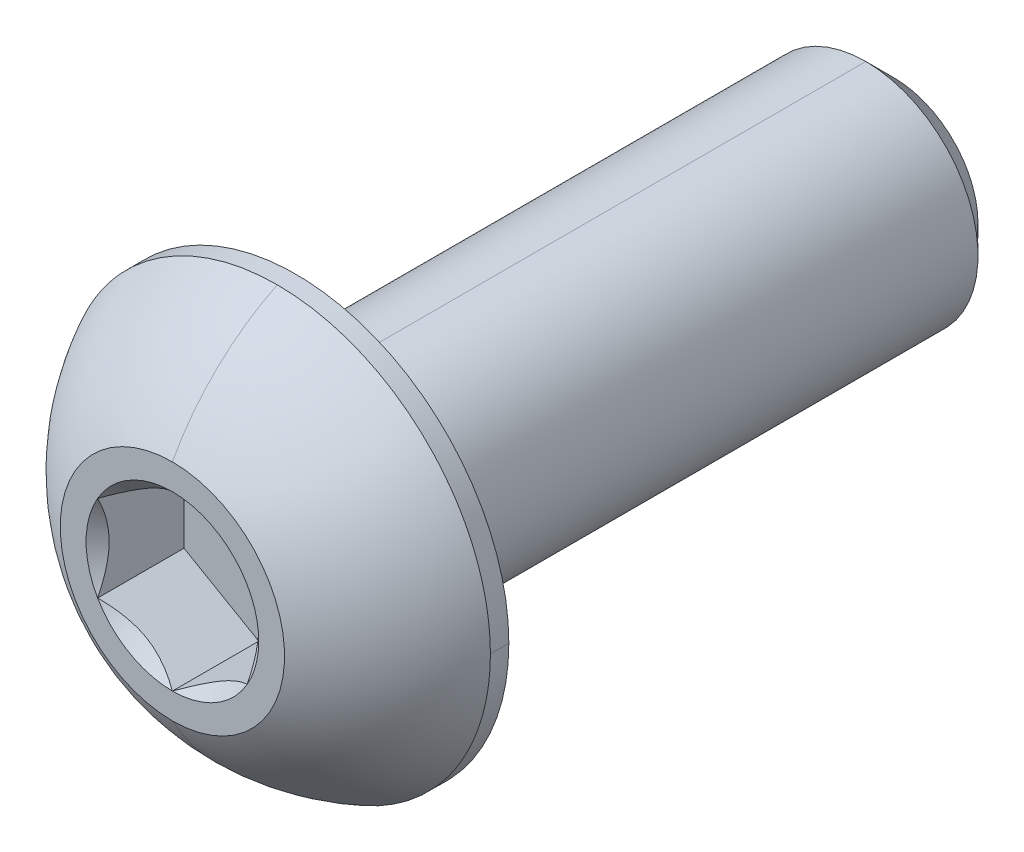
ISO-10303-21;
HEADER;
FILE_DESCRIPTION(('STEP AP214'),'2;1');
FILE_NAME('part.step','',(''),(''),'','','');
FILE_SCHEMA(('AUTOMOTIVE_DESIGN { 1 0 10303 214 1 1 1 1 }'));
ENDSEC;
DATA;
#1=APPLICATION_CONTEXT('core data for automotive mechanical design processes');
#2=APPLICATION_PROTOCOL_DEFINITION('international standard','automotive_design',2000,#1);
#3=PRODUCT_CONTEXT('',#1,'mechanical');
#4=PRODUCT('Part','Part','',(#3));
#5=PRODUCT_RELATED_PRODUCT_CATEGORY('part','',(#4));
#6=PRODUCT_DEFINITION_FORMATION('','',#4);
#7=PRODUCT_DEFINITION_CONTEXT('part definition',#1,'design');
#8=PRODUCT_DEFINITION('design','',#6,#7);
#9=PRODUCT_DEFINITION_SHAPE('','',#8);
#10=(LENGTH_UNIT() NAMED_UNIT(*) SI_UNIT(.MILLI.,.METRE.));
#11=(NAMED_UNIT(*) PLANE_ANGLE_UNIT() SI_UNIT($,.RADIAN.));
#12=(NAMED_UNIT(*) SI_UNIT($,.STERADIAN.) SOLID_ANGLE_UNIT());
#13=UNCERTAINTY_MEASURE_WITH_UNIT(LENGTH_MEASURE(1.E-05),#10,'distance_accuracy_value','');
#14=(GEOMETRIC_REPRESENTATION_CONTEXT(3) GLOBAL_UNCERTAINTY_ASSIGNED_CONTEXT((#13)) GLOBAL_UNIT_ASSIGNED_CONTEXT((#10,
#11,#12)) REPRESENTATION_CONTEXT('',''));
#15=CARTESIAN_POINT('',(0.,0.,0.));
#16=DIRECTION('',(0.,0.,1.));
#17=DIRECTION('',(1.,0.,0.));
#18=AXIS2_PLACEMENT_3D('',#15,#16,#17);
#19=CARTESIAN_POINT('',(0.,-1.15470053837925,-1.155));
#20=DIRECTION('',(0.5,-0.866025403784438,0.));
#21=DIRECTION('',(0.,0.,-1.));
#22=AXIS2_PLACEMENT_3D('',#19,#20,#21);
#23=PLANE('',#22);
#24=DIRECTION('',(0.,0.,1.));
#25=VECTOR('',#24,1.);
#26=CARTESIAN_POINT('',(0.,-1.15470053837925,-1.155));
#27=LINE('',#26,#25);
#28=CARTESIAN_POINT('',(0.,-1.15470053837925,-1.155));
#29=VERTEX_POINT('',#28);
#30=CARTESIAN_POINT('',(0.,-1.15470053837925,0.));
#31=VERTEX_POINT('',#30);
#32=EDGE_CURVE('E11',#29,#31,#27,.T.);
#33=ORIENTED_EDGE('',*,*,#32,.T.);
#34=CARTESIAN_POINT('',(0.,-1.15470053837925,0.));
#35=CARTESIAN_POINT('',(0.266698593283594,-1.00072203375447,-0.153978504624778));
#36=CARTESIAN_POINT('',(0.498157365873932,-0.867089249093143,-0.15469827484816));
#37=CARTESIAN_POINT('',(0.730801664071488,-0.732772000903351,-0.155421731715265));
#38=CARTESIAN_POINT('',(0.999999999999998,-0.577350269189627,0.));
#39=B_SPLINE_CURVE_WITH_KNOTS('',2,(#34,#35,#36,#37,#38),.UNSPECIFIED.,.F.,.F.,(3,2,3),(0.,0.5,
1.),.UNSPECIFIED.);
#40=CARTESIAN_POINT('',(1.,-0.577350269189627,0.));
#41=VERTEX_POINT('',#40);
#42=EDGE_CURVE('E149',#31,#41,#39,.T.);
#43=ORIENTED_EDGE('',*,*,#42,.T.);
#44=DIRECTION('',(0.,0.,1.));
#45=VECTOR('',#44,1.);
#46=CARTESIAN_POINT('',(1.,-0.577350269189626,-1.155));
#47=LINE('',#46,#45);
#48=CARTESIAN_POINT('',(1.,-0.577350269189626,-1.155));
#49=VERTEX_POINT('',#48);
#50=EDGE_CURVE('E205',#49,#41,#47,.T.);
#51=ORIENTED_EDGE('',*,*,#50,.F.);
#52=DIRECTION('',(0.866025403784438,0.5,0.));
#53=VECTOR('',#52,1.);
#54=CARTESIAN_POINT('',(0.,-1.15470053837925,-1.155));
#55=LINE('',#54,#53);
#56=EDGE_CURVE('E153',#29,#49,#55,.T.);
#57=ORIENTED_EDGE('',*,*,#56,.F.);
#58=EDGE_LOOP('',(#33,#43,#51,#57));
#59=FACE_BOUND('',#58,.T.);
#60=ADVANCED_FACE('F16',(#59),#23,.F.);
#61=CARTESIAN_POINT('',(-1.,-0.577350269189626,-1.155));
#62=DIRECTION('',(-0.5,-0.866025403784439,0.));
#63=DIRECTION('',(-0.866025403784439,0.5,0.));
#64=AXIS2_PLACEMENT_3D('',#61,#62,#63);
#65=PLANE('',#64);
#66=DIRECTION('',(0.,0.,1.));
#67=VECTOR('',#66,1.);
#68=CARTESIAN_POINT('',(-1.,-0.577350269189626,-1.155));
#69=LINE('',#68,#67);
#70=CARTESIAN_POINT('',(-1.,-0.577350269189626,-1.155));
#71=VERTEX_POINT('',#70);
#72=CARTESIAN_POINT('',(-1.,-0.577350269189627,0.));
#73=VERTEX_POINT('',#72);
#74=EDGE_CURVE('E29',#71,#73,#69,.T.);
#75=ORIENTED_EDGE('',*,*,#74,.T.);
#76=CARTESIAN_POINT('',(-1.,-0.577350269189626,0.));
#77=CARTESIAN_POINT('',(-0.733301406716315,-0.731328773814456,-0.15397850462483));
#78=CARTESIAN_POINT('',(-0.501842634126067,-0.864961558475736,-0.15469827484816));
#79=CARTESIAN_POINT('',(-0.26919833592842,-0.999278806665579,-0.155421731715212));
#80=CARTESIAN_POINT('',(0.,-1.15470053837925,0.));
#81=B_SPLINE_CURVE_WITH_KNOTS('',2,(#76,#77,#78,#79,#80),.UNSPECIFIED.,.F.,.F.,(3,2,3),(0.,0.5,
1.),.UNSPECIFIED.);
#82=EDGE_CURVE('E165',#73,#31,#81,.T.);
#83=ORIENTED_EDGE('',*,*,#82,.T.);
#84=ORIENTED_EDGE('',*,*,#32,.F.);
#85=DIRECTION('',(0.866025403784439,-0.5,0.));
#86=VECTOR('',#85,1.);
#87=CARTESIAN_POINT('',(-1.,-0.577350269189626,-1.155));
#88=LINE('',#87,#86);
#89=EDGE_CURVE('E208',#71,#29,#88,.T.);
#90=ORIENTED_EDGE('',*,*,#89,.F.);
#91=EDGE_LOOP('',(#75,#83,#84,#90));
#92=FACE_BOUND('',#91,.T.);
#93=ADVANCED_FACE('F171',(#92),#65,.F.);
#94=CARTESIAN_POINT('',(-1.,0.577350269189626,-1.155));
#95=DIRECTION('',(-1.,0.,0.));
#96=DIRECTION('',(0.,1.,0.));
#97=AXIS2_PLACEMENT_3D('',#94,#95,#96);
#98=PLANE('',#97);
#99=DIRECTION('',(0.,0.,1.));
#100=VECTOR('',#99,1.);
#101=CARTESIAN_POINT('',(-1.,0.577350269189626,-1.155));
#102=LINE('',#101,#100);
#103=CARTESIAN_POINT('',(-1.,0.577350269189626,-1.155));
#104=VERTEX_POINT('',#103);
#105=CARTESIAN_POINT('',(-1.,0.577350269189626,0.));
#106=VERTEX_POINT('',#105);
#107=EDGE_CURVE('E357',#104,#106,#102,.T.);
#108=ORIENTED_EDGE('',*,*,#107,.T.);
#109=CARTESIAN_POINT('',(-1.,0.577350269189626,0.));
#110=CARTESIAN_POINT('',(-1.,0.268289835380603,-0.154530216904512));
#111=CARTESIAN_POINT('',(-1.,6.29475276019533E-05,-0.154700536398056));
#112=CARTESIAN_POINT('',(-1.,-0.267609261829173,-0.154870503680228));
#113=CARTESIAN_POINT('',(-1.,-0.577350269189626,0.));
#114=B_SPLINE_CURVE_WITH_KNOTS('',2,(#109,#110,#111,#112,#113),.UNSPECIFIED.,.F.,.F.,(3,2,3),
(0.,0.5,1.),.UNSPECIFIED.);
#115=EDGE_CURVE('E175',#106,#73,#114,.T.);
#116=ORIENTED_EDGE('',*,*,#115,.T.);
#117=ORIENTED_EDGE('',*,*,#74,.F.);
#118=DIRECTION('',(0.,-1.,0.));
#119=VECTOR('',#118,1.);
#120=CARTESIAN_POINT('',(-1.,0.577350269189626,-1.155));
#121=LINE('',#120,#119);
#122=EDGE_CURVE('E221',#104,#71,#121,.T.);
#123=ORIENTED_EDGE('',*,*,#122,.F.);
#124=EDGE_LOOP('',(#108,#116,#117,#123));
#125=FACE_BOUND('',#124,.T.);
#126=ADVANCED_FACE('F371',(#125),#98,.F.);
#127=CARTESIAN_POINT('',(0.,1.15470053837925,-1.155));
#128=DIRECTION('',(-0.5,0.866025403784438,0.));
#129=DIRECTION('',(0.,0.,1.));
#130=AXIS2_PLACEMENT_3D('',#127,#128,#129);
#131=PLANE('',#130);
#132=DIRECTION('',(0.,0.,1.));
#133=VECTOR('',#132,1.);
#134=CARTESIAN_POINT('',(0.,1.15470053837925,-1.155));
#135=LINE('',#134,#133);
#136=CARTESIAN_POINT('',(0.,1.15470053837925,-1.155));
#137=VERTEX_POINT('',#136);
#138=CARTESIAN_POINT('',(0.,1.15470053837925,0.));
#139=VERTEX_POINT('',#138);
#140=EDGE_CURVE('E218',#137,#139,#135,.T.);
#141=ORIENTED_EDGE('',*,*,#140,.T.);
#142=CARTESIAN_POINT('',(0.,1.15470053837925,0.));
#143=CARTESIAN_POINT('',(-0.266698593283596,1.00072203375447,-0.153978504624778));
#144=CARTESIAN_POINT('',(-0.498157365873932,0.867089249093143,-0.15469827484816));
#145=CARTESIAN_POINT('',(-0.730801664071488,0.732772000903352,-0.155421731715265));
#146=CARTESIAN_POINT('',(-0.999999999999998,0.577350269189627,0.));
#147=B_SPLINE_CURVE_WITH_KNOTS('',2,(#142,#143,#144,#145,#146),.UNSPECIFIED.,.F.,.F.,(3,2,3),
(0.,0.5,1.),.UNSPECIFIED.);
#148=EDGE_CURVE('E404',#139,#106,#147,.T.);
#149=ORIENTED_EDGE('',*,*,#148,.T.);
#150=ORIENTED_EDGE('',*,*,#107,.F.);
#151=DIRECTION('',(-0.866025403784439,-0.5,0.));
#152=VECTOR('',#151,1.);
#153=CARTESIAN_POINT('',(0.,1.15470053837925,-1.155));
#154=LINE('',#153,#152);
#155=EDGE_CURVE('E230',#137,#104,#154,.T.);
#156=ORIENTED_EDGE('',*,*,#155,.F.);
#157=EDGE_LOOP('',(#141,#149,#150,#156));
#158=FACE_BOUND('',#157,.T.);
#159=ADVANCED_FACE('F381',(#158),#131,.F.);
#160=CARTESIAN_POINT('',(1.,0.577350269189626,-1.155));
#161=DIRECTION('',(0.5,0.866025403784439,0.));
#162=DIRECTION('',(0.,0.,-1.));
#163=AXIS2_PLACEMENT_3D('',#160,#161,#162);
#164=PLANE('',#163);
#165=DIRECTION('',(0.,0.,1.));
#166=VECTOR('',#165,1.);
#167=CARTESIAN_POINT('',(1.,0.577350269189626,-1.155));
#168=LINE('',#167,#166);
#169=CARTESIAN_POINT('',(1.,0.577350269189626,-1.155));
#170=VERTEX_POINT('',#169);
#171=CARTESIAN_POINT('',(1.,0.577350269189627,0.));
#172=VERTEX_POINT('',#171);
#173=EDGE_CURVE('E207',#170,#172,#168,.T.);
#174=ORIENTED_EDGE('',*,*,#173,.T.);
#175=CARTESIAN_POINT('',(1.,0.577350269189626,0.));
#176=CARTESIAN_POINT('',(0.733301406716314,0.731328773814457,-0.153978504624832));
#177=CARTESIAN_POINT('',(0.501842634126067,0.864961558475736,-0.15469827484816));
#178=CARTESIAN_POINT('',(0.269198335928417,0.99927880666558,-0.155421731715211));
#179=CARTESIAN_POINT('',(0.,1.15470053837925,0.));
#180=B_SPLINE_CURVE_WITH_KNOTS('',2,(#175,#176,#177,#178,#179),.UNSPECIFIED.,.F.,.F.,(3,2,3),
(0.,0.5,1.),.UNSPECIFIED.);
#181=EDGE_CURVE('E881',#172,#139,#180,.T.);
#182=ORIENTED_EDGE('',*,*,#181,.T.);
#183=ORIENTED_EDGE('',*,*,#140,.F.);
#184=DIRECTION('',(-0.866025403784439,0.5,0.));
#185=VECTOR('',#184,1.);
#186=CARTESIAN_POINT('',(1.,0.577350269189626,-1.155));
#187=LINE('',#186,#185);
#188=EDGE_CURVE('E234',#170,#137,#187,.T.);
#189=ORIENTED_EDGE('',*,*,#188,.F.);
#190=EDGE_LOOP('',(#174,#182,#183,#189));
#191=FACE_BOUND('',#190,.T.);
#192=ADVANCED_FACE('F327',(#191),#164,.F.);
#193=CARTESIAN_POINT('',(1.,-0.577350269189626,-1.155));
#194=DIRECTION('',(1.,0.,0.));
#195=DIRECTION('',(0.,1.,0.));
#196=AXIS2_PLACEMENT_3D('',#193,#194,#195);
#197=PLANE('',#196);
#198=ORIENTED_EDGE('',*,*,#50,.T.);
#199=CARTESIAN_POINT('',(1.,-0.577350269189627,0.));
#200=CARTESIAN_POINT('',(1.,-0.267949192431124,-0.154700538379252));
#201=CARTESIAN_POINT('',(1.,0.,-0.154700538379252));
#202=B_SPLINE_CURVE_WITH_KNOTS('',2,(#199,#200,#201),.UNSPECIFIED.,.F.,.F.,(3,3),(0.,1.),.UNSPECIFIED.);
#203=CARTESIAN_POINT('',(1.,0.,-0.154700538379251));
#204=VERTEX_POINT('',#203);
#205=EDGE_CURVE('E238',#41,#204,#202,.T.);
#206=ORIENTED_EDGE('',*,*,#205,.T.);
#207=CARTESIAN_POINT('',(1.,0.,-0.154700538379252));
#208=CARTESIAN_POINT('',(1.,0.267949192431123,-0.154700538379252));
#209=CARTESIAN_POINT('',(1.,0.577350269189626,0.));
#210=B_SPLINE_CURVE_WITH_KNOTS('',2,(#207,#208,#209),.UNSPECIFIED.,.F.,.F.,(3,3),(0.,1.),.UNSPECIFIED.);
#211=EDGE_CURVE('E872',#204,#172,#210,.T.);
#212=ORIENTED_EDGE('',*,*,#211,.T.);
#213=ORIENTED_EDGE('',*,*,#173,.F.);
#214=DIRECTION('',(0.,1.,0.));
#215=VECTOR('',#214,1.);
#216=CARTESIAN_POINT('',(1.,-0.577350269189626,-1.155));
#217=LINE('',#216,#215);
#218=EDGE_CURVE('E301',#49,#170,#217,.T.);
#219=ORIENTED_EDGE('',*,*,#218,.F.);
#220=EDGE_LOOP('',(#198,#206,#212,#213,#219));
#221=FACE_BOUND('',#220,.T.);
#222=ADVANCED_FACE('F453',(#221),#197,.F.);
#223=CARTESIAN_POINT('',(1.,-0.577350269189626,-1.155));
#224=DIRECTION('',(0.,0.,1.));
#225=DIRECTION('',(1.,0.,0.));
#226=AXIS2_PLACEMENT_3D('',#223,#224,#225);
#227=PLANE('',#226);
#228=ORIENTED_EDGE('',*,*,#56,.T.);
#229=ORIENTED_EDGE('',*,*,#218,.T.);
#230=ORIENTED_EDGE('',*,*,#188,.T.);
#231=ORIENTED_EDGE('',*,*,#155,.T.);
#232=ORIENTED_EDGE('',*,*,#122,.T.);
#233=ORIENTED_EDGE('',*,*,#89,.T.);
#234=EDGE_LOOP('',(#228,#229,#230,#231,#232,#233));
#235=FACE_BOUND('',#234,.T.);
#236=ADVANCED_FACE('F382',(#235),#227,.T.);
#237=CARTESIAN_POINT('',(0.,0.,0.));
#238=DIRECTION('',(0.,0.,1.));
#239=DIRECTION('',(1.,0.,0.));
#240=AXIS2_PLACEMENT_3D('',#237,#238,#239);
#241=CONICAL_SURFACE('',#240,1.15470053837925,0.78539816339745);
#242=CARTESIAN_POINT('',(0.,0.,0.));
#243=DIRECTION('',(0.,0.,1.));
#244=DIRECTION('',(1.,0.,0.));
#245=AXIS2_PLACEMENT_3D('',#242,#243,#244);
#246=CIRCLE('',#245,1.15470053837925);
#247=EDGE_CURVE('E162',#31,#41,#246,.T.);
#248=ORIENTED_EDGE('',*,*,#247,.T.);
#249=ORIENTED_EDGE('',*,*,#42,.F.);
#250=EDGE_LOOP('',(#248,#249));
#251=FACE_BOUND('',#250,.T.);
#252=ADVANCED_FACE('F160',(#251),#241,.F.);
#253=CARTESIAN_POINT('',(0.,0.,0.));
#254=DIRECTION('',(0.,0.,1.));
#255=DIRECTION('',(1.,0.,0.));
#256=AXIS2_PLACEMENT_3D('',#253,#254,#255);
#257=CONICAL_SURFACE('',#256,1.15470053837925,0.78539816339745);
#258=CARTESIAN_POINT('',(0.,0.,0.));
#259=DIRECTION('',(0.,0.,1.));
#260=DIRECTION('',(1.,0.,0.));
#261=AXIS2_PLACEMENT_3D('',#258,#259,#260);
#262=CIRCLE('',#261,1.15470053837925);
#263=EDGE_CURVE('E179',#73,#31,#262,.T.);
#264=ORIENTED_EDGE('',*,*,#263,.T.);
#265=ORIENTED_EDGE('',*,*,#82,.F.);
#266=EDGE_LOOP('',(#264,#265));
#267=FACE_BOUND('',#266,.T.);
#268=ADVANCED_FACE('F180',(#267),#257,.F.);
#269=CARTESIAN_POINT('',(0.,0.,0.));
#270=DIRECTION('',(0.,0.,1.));
#271=DIRECTION('',(1.,0.,0.));
#272=AXIS2_PLACEMENT_3D('',#269,#270,#271);
#273=CONICAL_SURFACE('',#272,1.15470053837925,0.78539816339745);
#274=CARTESIAN_POINT('',(0.,0.,0.));
#275=DIRECTION('',(0.,0.,1.));
#276=DIRECTION('',(1.,0.,0.));
#277=AXIS2_PLACEMENT_3D('',#274,#275,#276);
#278=CIRCLE('',#277,1.15470053837925);
#279=EDGE_CURVE('E288',#106,#73,#278,.T.);
#280=ORIENTED_EDGE('',*,*,#279,.T.);
#281=ORIENTED_EDGE('',*,*,#115,.F.);
#282=EDGE_LOOP('',(#280,#281));
#283=FACE_BOUND('',#282,.T.);
#284=ADVANCED_FACE('F343',(#283),#273,.F.);
#285=CARTESIAN_POINT('',(0.,0.,0.));
#286=DIRECTION('',(0.,0.,1.));
#287=DIRECTION('',(1.,0.,0.));
#288=AXIS2_PLACEMENT_3D('',#285,#286,#287);
#289=CONICAL_SURFACE('',#288,1.15470053837925,0.78539816339745);
#290=CARTESIAN_POINT('',(0.,0.,0.));
#291=DIRECTION('',(0.,0.,1.));
#292=DIRECTION('',(1.,0.,0.));
#293=AXIS2_PLACEMENT_3D('',#290,#291,#292);
#294=CIRCLE('',#293,1.15470053837925);
#295=EDGE_CURVE('E361',#139,#106,#294,.T.);
#296=ORIENTED_EDGE('',*,*,#295,.T.);
#297=ORIENTED_EDGE('',*,*,#148,.F.);
#298=EDGE_LOOP('',(#296,#297));
#299=FACE_BOUND('',#298,.T.);
#300=ADVANCED_FACE('F411',(#299),#289,.F.);
#301=CARTESIAN_POINT('',(0.,0.,0.));
#302=DIRECTION('',(0.,0.,1.));
#303=DIRECTION('',(1.,0.,0.));
#304=AXIS2_PLACEMENT_3D('',#301,#302,#303);
#305=CONICAL_SURFACE('',#304,1.15470053837925,0.78539816339745);
#306=CARTESIAN_POINT('',(0.,0.,0.));
#307=DIRECTION('',(0.,0.,1.));
#308=DIRECTION('',(1.,0.,0.));
#309=AXIS2_PLACEMENT_3D('',#306,#307,#308);
#310=CIRCLE('',#309,1.15470053837925);
#311=EDGE_CURVE('E198',#172,#139,#310,.T.);
#312=ORIENTED_EDGE('',*,*,#311,.T.);
#313=ORIENTED_EDGE('',*,*,#181,.F.);
#314=EDGE_LOOP('',(#312,#313));
#315=FACE_BOUND('',#314,.T.);
#316=ADVANCED_FACE('F420',(#315),#305,.F.);
#317=CARTESIAN_POINT('',(0.,0.,0.));
#318=DIRECTION('',(0.,0.,1.));
#319=DIRECTION('',(1.,0.,0.));
#320=AXIS2_PLACEMENT_3D('',#317,#318,#319);
#321=CONICAL_SURFACE('',#320,1.15470053837925,0.78539816339745);
#322=DIRECTION('',(0.707106781186549,0.,0.707106781186546));
#323=VECTOR('',#322,1.);
#324=CARTESIAN_POINT('',(1.15470053837925,0.,0.));
#325=LINE('',#324,#323);
#326=CARTESIAN_POINT('',(1.15470053837925,0.,0.));
#327=VERTEX_POINT('',#326);
#328=EDGE_CURVE('E901',#204,#327,#325,.T.);
#329=ORIENTED_EDGE('',*,*,#328,.F.);
#330=ORIENTED_EDGE('',*,*,#205,.F.);
#331=CARTESIAN_POINT('',(0.,0.,0.));
#332=DIRECTION('',(0.,0.,1.));
#333=DIRECTION('',(1.,0.,0.));
#334=AXIS2_PLACEMENT_3D('',#331,#332,#333);
#335=CIRCLE('',#334,1.15470053837925);
#336=EDGE_CURVE('E190',#41,#327,#335,.T.);
#337=ORIENTED_EDGE('',*,*,#336,.T.);
#338=EDGE_LOOP('',(#329,#330,#337));
#339=FACE_BOUND('',#338,.T.);
#340=ADVANCED_FACE('F490',(#339),#321,.F.);
#341=CARTESIAN_POINT('',(0.,0.,0.));
#342=DIRECTION('',(0.,0.,1.));
#343=DIRECTION('',(1.,0.,0.));
#344=AXIS2_PLACEMENT_3D('',#341,#342,#343);
#345=CYLINDRICAL_SURFACE('',#344,2.85);
#346=DIRECTION('',(0.,0.,1.));
#347=VECTOR('',#346,1.);
#348=CARTESIAN_POINT('',(-2.85,0.,0.));
#349=LINE('',#348,#347);
#350=CARTESIAN_POINT('',(-2.85,0.,-1.65));
#351=VERTEX_POINT('',#350);
#352=CARTESIAN_POINT('',(-2.85,0.,-1.4025));
#353=VERTEX_POINT('',#352);
#354=EDGE_CURVE('E249',#351,#353,#349,.T.);
#355=ORIENTED_EDGE('',*,*,#354,.F.);
#356=CARTESIAN_POINT('',(0.,0.,-1.65));
#357=DIRECTION('',(0.,0.,1.));
#358=DIRECTION('',(1.,0.,0.));
#359=AXIS2_PLACEMENT_3D('',#356,#357,#358);
#360=CIRCLE('',#359,2.85);
#361=CARTESIAN_POINT('',(2.85,0.,-1.65));
#362=VERTEX_POINT('',#361);
#363=EDGE_CURVE('E185',#351,#362,#360,.T.);
#364=ORIENTED_EDGE('',*,*,#363,.T.);
#365=DIRECTION('',(0.,0.,1.));
#366=VECTOR('',#365,1.);
#367=CARTESIAN_POINT('',(2.85,0.,0.));
#368=LINE('',#367,#366);
#369=CARTESIAN_POINT('',(2.85,0.,-1.4025));
#370=VERTEX_POINT('',#369);
#371=EDGE_CURVE('E239',#362,#370,#368,.T.);
#372=ORIENTED_EDGE('',*,*,#371,.T.);
#373=CARTESIAN_POINT('',(0.,0.,-1.4025));
#374=DIRECTION('',(0.,0.,1.));
#375=DIRECTION('',(1.,0.,0.));
#376=AXIS2_PLACEMENT_3D('',#373,#374,#375);
#377=CIRCLE('',#376,2.85);
#378=CARTESIAN_POINT('',(0.,-2.85,-1.4025));
#379=VERTEX_POINT('',#378);
#380=EDGE_CURVE('E243',#379,#370,#377,.T.);
#381=ORIENTED_EDGE('',*,*,#380,.F.);
#382=CARTESIAN_POINT('',(0.,0.,-1.4025));
#383=DIRECTION('',(0.,0.,1.));
#384=DIRECTION('',(1.,0.,0.));
#385=AXIS2_PLACEMENT_3D('',#382,#383,#384);
#386=CIRCLE('',#385,2.85);
#387=EDGE_CURVE('E289',#353,#379,#386,.T.);
#388=ORIENTED_EDGE('',*,*,#387,.F.);
#389=EDGE_LOOP('',(#355,#364,#372,#381,#388));
#390=FACE_BOUND('',#389,.T.);
#391=ADVANCED_FACE('F498',(#390),#345,.T.);
#392=CARTESIAN_POINT('',(0.,-2.85,-1.65));
#393=DIRECTION('',(0.,0.,1.));
#394=DIRECTION('',(1.,0.,0.));
#395=AXIS2_PLACEMENT_3D('',#392,#393,#394);
#396=PLANE('',#395);
#397=CARTESIAN_POINT('',(0.,0.,-1.65));
#398=DIRECTION('',(0.,0.,-1.));
#399=DIRECTION('',(1.,0.,0.));
#400=AXIS2_PLACEMENT_3D('',#397,#398,#399);
#401=CIRCLE('',#400,1.5);
#402=CARTESIAN_POINT('',(0.,1.5,-1.65));
#403=VERTEX_POINT('',#402);
#404=CARTESIAN_POINT('',(0.,-1.5,-1.65));
#405=VERTEX_POINT('',#404);
#406=EDGE_CURVE('E262',#403,#405,#401,.T.);
#407=ORIENTED_EDGE('',*,*,#406,.F.);
#408=CARTESIAN_POINT('',(0.,0.,-1.65));
#409=DIRECTION('',(0.,0.,-1.));
#410=DIRECTION('',(1.,0.,0.));
#411=AXIS2_PLACEMENT_3D('',#408,#409,#410);
#412=CIRCLE('',#411,1.5);
#413=EDGE_CURVE('E270',#405,#403,#412,.T.);
#414=ORIENTED_EDGE('',*,*,#413,.F.);
#415=EDGE_LOOP('',(#407,#414));
#416=FACE_BOUND('',#415,.T.);
#417=CARTESIAN_POINT('',(0.,0.,-1.65));
#418=DIRECTION('',(0.,0.,1.));
#419=DIRECTION('',(1.,0.,0.));
#420=AXIS2_PLACEMENT_3D('',#417,#418,#419);
#421=CIRCLE('',#420,2.85);
#422=EDGE_CURVE('E275',#362,#351,#421,.T.);
#423=ORIENTED_EDGE('',*,*,#422,.F.);
#424=ORIENTED_EDGE('',*,*,#363,.F.);
#425=EDGE_LOOP('',(#423,#424));
#426=FACE_BOUND('',#425,.T.);
#427=ADVANCED_FACE('F506',(#416,#426),#396,.F.);
#428=CARTESIAN_POINT('',(0.,-1.5,0.));
#429=DIRECTION('',(0.,0.,-1.));
#430=DIRECTION('',(0.,-1.,0.));
#431=AXIS2_PLACEMENT_3D('',#428,#429,#430);
#432=PLANE('',#431);
#433=ORIENTED_EDGE('',*,*,#279,.F.);
#434=ORIENTED_EDGE('',*,*,#295,.F.);
#435=ORIENTED_EDGE('',*,*,#311,.F.);
#436=CARTESIAN_POINT('',(0.,0.,0.));
#437=DIRECTION('',(0.,0.,1.));
#438=DIRECTION('',(1.,0.,0.));
#439=AXIS2_PLACEMENT_3D('',#436,#437,#438);
#440=CIRCLE('',#439,1.15470053837925);
#441=EDGE_CURVE('E278',#327,#172,#440,.T.);
#442=ORIENTED_EDGE('',*,*,#441,.F.);
#443=ORIENTED_EDGE('',*,*,#336,.F.);
#444=ORIENTED_EDGE('',*,*,#247,.F.);
#445=ORIENTED_EDGE('',*,*,#263,.F.);
#446=EDGE_LOOP('',(#433,#434,#435,#442,#443,#444,#445));
#447=FACE_BOUND('',#446,.T.);
#448=CARTESIAN_POINT('',(0.,0.,0.));
#449=DIRECTION('',(0.,0.,1.));
#450=DIRECTION('',(1.,0.,0.));
#451=AXIS2_PLACEMENT_3D('',#448,#449,#450);
#452=CIRCLE('',#451,1.5);
#453=CARTESIAN_POINT('',(0.,-1.5,0.));
#454=VERTEX_POINT('',#453);
#455=CARTESIAN_POINT('',(0.,1.5,0.));
#456=VERTEX_POINT('',#455);
#457=EDGE_CURVE('E293',#454,#456,#452,.T.);
#458=ORIENTED_EDGE('',*,*,#457,.T.);
#459=CARTESIAN_POINT('',(0.,0.,0.));
#460=DIRECTION('',(0.,0.,1.));
#461=DIRECTION('',(1.,0.,0.));
#462=AXIS2_PLACEMENT_3D('',#459,#460,#461);
#463=CIRCLE('',#462,1.5);
#464=EDGE_CURVE('E285',#456,#454,#463,.T.);
#465=ORIENTED_EDGE('',*,*,#464,.T.);
#466=EDGE_LOOP('',(#458,#465));
#467=FACE_BOUND('',#466,.T.);
#468=ADVANCED_FACE('F187',(#447,#467),#432,.F.);
#469=CARTESIAN_POINT('',(0.,0.,-2.79483288770054));
#470=DIRECTION('',(1.,0.,0.));
#471=DIRECTION('',(0.,-1.,0.));
#472=AXIS2_PLACEMENT_3D('',#469,#470,#471);
#473=SPHERICAL_SURFACE('',#472,3.17192226735973);
#474=CARTESIAN_POINT('',(0.,0.,-2.79483288770054));
#475=DIRECTION('',(1.,0.,0.));
#476=DIRECTION('',(0.,1.,0.));
#477=AXIS2_PLACEMENT_3D('',#474,#475,#476);
#478=CIRCLE('',#477,3.17192226735973);
#479=CARTESIAN_POINT('',(0.,2.85,-1.4025));
#480=VERTEX_POINT('',#479);
#481=EDGE_CURVE('E280',#480,#456,#478,.T.);
#482=ORIENTED_EDGE('',*,*,#481,.F.);
#483=CARTESIAN_POINT('',(0.,0.,-1.4025));
#484=DIRECTION('',(0.,0.,1.));
#485=DIRECTION('',(1.,0.,0.));
#486=AXIS2_PLACEMENT_3D('',#483,#484,#485);
#487=CIRCLE('',#486,2.85);
#488=EDGE_CURVE('E245',#480,#353,#487,.T.);
#489=ORIENTED_EDGE('',*,*,#488,.T.);
#490=ORIENTED_EDGE('',*,*,#387,.T.);
#491=CARTESIAN_POINT('',(0.,0.,-2.79483288770054));
#492=DIRECTION('',(-1.,0.,0.));
#493=DIRECTION('',(0.,-1.,0.));
#494=AXIS2_PLACEMENT_3D('',#491,#492,#493);
#495=CIRCLE('',#494,3.17192226735973);
#496=EDGE_CURVE('E297',#379,#454,#495,.T.);
#497=ORIENTED_EDGE('',*,*,#496,.T.);
#498=ORIENTED_EDGE('',*,*,#464,.F.);
#499=EDGE_LOOP('',(#482,#489,#490,#497,#498));
#500=FACE_BOUND('',#499,.T.);
#501=ADVANCED_FACE('F344',(#500),#473,.T.);
#502=CARTESIAN_POINT('',(0.,0.,-9.65));
#503=DIRECTION('',(0.,0.,1.));
#504=DIRECTION('',(0.,-1.,0.));
#505=AXIS2_PLACEMENT_3D('',#502,#503,#504);
#506=CONICAL_SURFACE('',#505,1.125,0.785398163397446);
#507=DIRECTION('',(0.,0.707106781186546,0.70710678118655));
#508=VECTOR('',#507,1.);
#509=CARTESIAN_POINT('',(0.,1.125,-9.65));
#510=LINE('',#509,#508);
#511=CARTESIAN_POINT('',(0.,1.125,-9.65));
#512=VERTEX_POINT('',#511);
#513=CARTESIAN_POINT('',(0.,1.5,-9.275));
#514=VERTEX_POINT('',#513);
#515=EDGE_CURVE('E255',#512,#514,#510,.T.);
#516=ORIENTED_EDGE('',*,*,#515,.F.);
#517=CARTESIAN_POINT('',(0.,0.,-9.65));
#518=DIRECTION('',(0.,0.,-1.));
#519=DIRECTION('',(0.,1.,0.));
#520=AXIS2_PLACEMENT_3D('',#517,#518,#519);
#521=CIRCLE('',#520,1.125);
#522=CARTESIAN_POINT('',(0.,-1.125,-9.65));
#523=VERTEX_POINT('',#522);
#524=EDGE_CURVE('E267',#523,#512,#521,.T.);
#525=ORIENTED_EDGE('',*,*,#524,.F.);
#526=DIRECTION('',(0.,-0.707106781186546,0.70710678118655));
#527=VECTOR('',#526,1.);
#528=CARTESIAN_POINT('',(0.,-1.125,-9.65));
#529=LINE('',#528,#527);
#530=CARTESIAN_POINT('',(0.,-1.5,-9.275));
#531=VERTEX_POINT('',#530);
#532=EDGE_CURVE('E254',#523,#531,#529,.T.);
#533=ORIENTED_EDGE('',*,*,#532,.T.);
#534=CARTESIAN_POINT('',(0.,0.,-9.275));
#535=DIRECTION('',(0.,0.,1.));
#536=DIRECTION('',(0.,1.,0.));
#537=AXIS2_PLACEMENT_3D('',#534,#535,#536);
#538=CIRCLE('',#537,1.5);
#539=EDGE_CURVE('E305',#514,#531,#538,.T.);
#540=ORIENTED_EDGE('',*,*,#539,.F.);
#541=EDGE_LOOP('',(#516,#525,#533,#540));
#542=FACE_BOUND('',#541,.T.);
#543=ADVANCED_FACE('F526',(#542),#506,.T.);
#544=CARTESIAN_POINT('',(0.,0.,-9.65));
#545=DIRECTION('',(0.,0.,-1.));
#546=DIRECTION('',(0.,1.,0.));
#547=AXIS2_PLACEMENT_3D('',#544,#545,#546);
#548=CYLINDRICAL_SURFACE('',#547,1.5);
#549=DIRECTION('',(0.,0.,-1.));
#550=VECTOR('',#549,1.);
#551=CARTESIAN_POINT('',(0.,-1.5,-9.65));
#552=LINE('',#551,#550);
#553=EDGE_CURVE('E266',#405,#531,#552,.T.);
#554=ORIENTED_EDGE('',*,*,#553,.F.);
#555=ORIENTED_EDGE('',*,*,#413,.T.);
#556=DIRECTION('',(0.,0.,-1.));
#557=VECTOR('',#556,1.);
#558=CARTESIAN_POINT('',(0.,1.5,-9.65));
#559=LINE('',#558,#557);
#560=EDGE_CURVE('E271',#403,#514,#559,.T.);
#561=ORIENTED_EDGE('',*,*,#560,.T.);
#562=ORIENTED_EDGE('',*,*,#539,.T.);
#563=EDGE_LOOP('',(#554,#555,#561,#562));
#564=FACE_BOUND('',#563,.T.);
#565=ADVANCED_FACE('F18',(#564),#548,.T.);
#566=CARTESIAN_POINT('',(0.,-1.5,-9.65));
#567=DIRECTION('',(0.,0.,-1.));
#568=DIRECTION('',(0.,-1.,0.));
#569=AXIS2_PLACEMENT_3D('',#566,#567,#568);
#570=PLANE('',#569);
#571=ORIENTED_EDGE('',*,*,#524,.T.);
#572=CARTESIAN_POINT('',(0.,0.,-9.65));
#573=DIRECTION('',(0.,0.,-1.));
#574=DIRECTION('',(0.,1.,0.));
#575=AXIS2_PLACEMENT_3D('',#572,#573,#574);
#576=CIRCLE('',#575,1.125);
#577=EDGE_CURVE('E284',#512,#523,#576,.T.);
#578=ORIENTED_EDGE('',*,*,#577,.T.);
#579=EDGE_LOOP('',(#571,#578));
#580=FACE_BOUND('',#579,.T.);
#581=ADVANCED_FACE('F335',(#580),#570,.T.);
#582=CARTESIAN_POINT('',(0.,0.,-9.65));
#583=DIRECTION('',(0.,0.,-1.));
#584=DIRECTION('',(0.,1.,0.));
#585=AXIS2_PLACEMENT_3D('',#582,#583,#584);
#586=CYLINDRICAL_SURFACE('',#585,1.5);
#587=ORIENTED_EDGE('',*,*,#406,.T.);
#588=ORIENTED_EDGE('',*,*,#553,.T.);
#589=CARTESIAN_POINT('',(0.,0.,-9.275));
#590=DIRECTION('',(0.,0.,1.));
#591=DIRECTION('',(0.,1.,0.));
#592=AXIS2_PLACEMENT_3D('',#589,#590,#591);
#593=CIRCLE('',#592,1.5);
#594=EDGE_CURVE('E250',#531,#514,#593,.T.);
#595=ORIENTED_EDGE('',*,*,#594,.T.);
#596=ORIENTED_EDGE('',*,*,#560,.F.);
#597=EDGE_LOOP('',(#587,#588,#595,#596));
#598=FACE_BOUND('',#597,.T.);
#599=ADVANCED_FACE('F338',(#598),#586,.T.);
#600=CARTESIAN_POINT('',(0.,0.,-9.65));
#601=DIRECTION('',(0.,0.,1.));
#602=DIRECTION('',(0.,-1.,0.));
#603=AXIS2_PLACEMENT_3D('',#600,#601,#602);
#604=CONICAL_SURFACE('',#603,1.125,0.785398163397446);
#605=ORIENTED_EDGE('',*,*,#577,.F.);
#606=ORIENTED_EDGE('',*,*,#515,.T.);
#607=ORIENTED_EDGE('',*,*,#594,.F.);
#608=ORIENTED_EDGE('',*,*,#532,.F.);
#609=EDGE_LOOP('',(#605,#606,#607,#608));
#610=FACE_BOUND('',#609,.T.);
#611=ADVANCED_FACE('F550',(#610),#604,.T.);
#612=CARTESIAN_POINT('',(0.,0.,-2.79483288770054));
#613=DIRECTION('',(1.,0.,0.));
#614=DIRECTION('',(0.,-1.,0.));
#615=AXIS2_PLACEMENT_3D('',#612,#613,#614);
#616=SPHERICAL_SURFACE('',#615,3.17192226735973);
#617=ORIENTED_EDGE('',*,*,#380,.T.);
#618=CARTESIAN_POINT('',(0.,0.,-1.4025));
#619=DIRECTION('',(0.,0.,1.));
#620=DIRECTION('',(1.,0.,0.));
#621=AXIS2_PLACEMENT_3D('',#618,#619,#620);
#622=CIRCLE('',#621,2.85);
#623=EDGE_CURVE('E244',#370,#480,#622,.T.);
#624=ORIENTED_EDGE('',*,*,#623,.T.);
#625=ORIENTED_EDGE('',*,*,#481,.T.);
#626=ORIENTED_EDGE('',*,*,#457,.F.);
#627=ORIENTED_EDGE('',*,*,#496,.F.);
#628=EDGE_LOOP('',(#617,#624,#625,#626,#627));
#629=FACE_BOUND('',#628,.T.);
#630=ADVANCED_FACE('F333',(#629),#616,.T.);
#631=CARTESIAN_POINT('',(0.,0.,0.));
#632=DIRECTION('',(0.,0.,1.));
#633=DIRECTION('',(1.,0.,0.));
#634=AXIS2_PLACEMENT_3D('',#631,#632,#633);
#635=CYLINDRICAL_SURFACE('',#634,2.85);
#636=ORIENTED_EDGE('',*,*,#422,.T.);
#637=ORIENTED_EDGE('',*,*,#354,.T.);
#638=ORIENTED_EDGE('',*,*,#488,.F.);
#639=ORIENTED_EDGE('',*,*,#623,.F.);
#640=ORIENTED_EDGE('',*,*,#371,.F.);
#641=EDGE_LOOP('',(#636,#637,#638,#639,#640));
#642=FACE_BOUND('',#641,.T.);
#643=ADVANCED_FACE('F329',(#642),#635,.T.);
#644=CARTESIAN_POINT('',(0.,0.,0.));
#645=DIRECTION('',(0.,0.,1.));
#646=DIRECTION('',(1.,0.,0.));
#647=AXIS2_PLACEMENT_3D('',#644,#645,#646);
#648=CONICAL_SURFACE('',#647,1.15470053837925,0.78539816339745);
#649=ORIENTED_EDGE('',*,*,#211,.F.);
#650=ORIENTED_EDGE('',*,*,#328,.T.);
#651=ORIENTED_EDGE('',*,*,#441,.T.);
#652=EDGE_LOOP('',(#649,#650,#651));
#653=FACE_BOUND('',#652,.T.);
#654=ADVANCED_FACE('F332',(#653),#648,.F.);
#655=CLOSED_SHELL('',(#60,#93,#126,#159,#192,#222,#236,#252,#268,#284,#300,#316,#340,#391,#427,
#468,#501,#543,#565,#581,#599,#611,#630,#643,#654));
#656=MANIFOLD_SOLID_BREP('B1',#655);
#657=ADVANCED_BREP_SHAPE_REPRESENTATION('',(#18,#656),#14);
#658=SHAPE_DEFINITION_REPRESENTATION(#9,#657);
ENDSEC;
END-ISO-10303-21;
